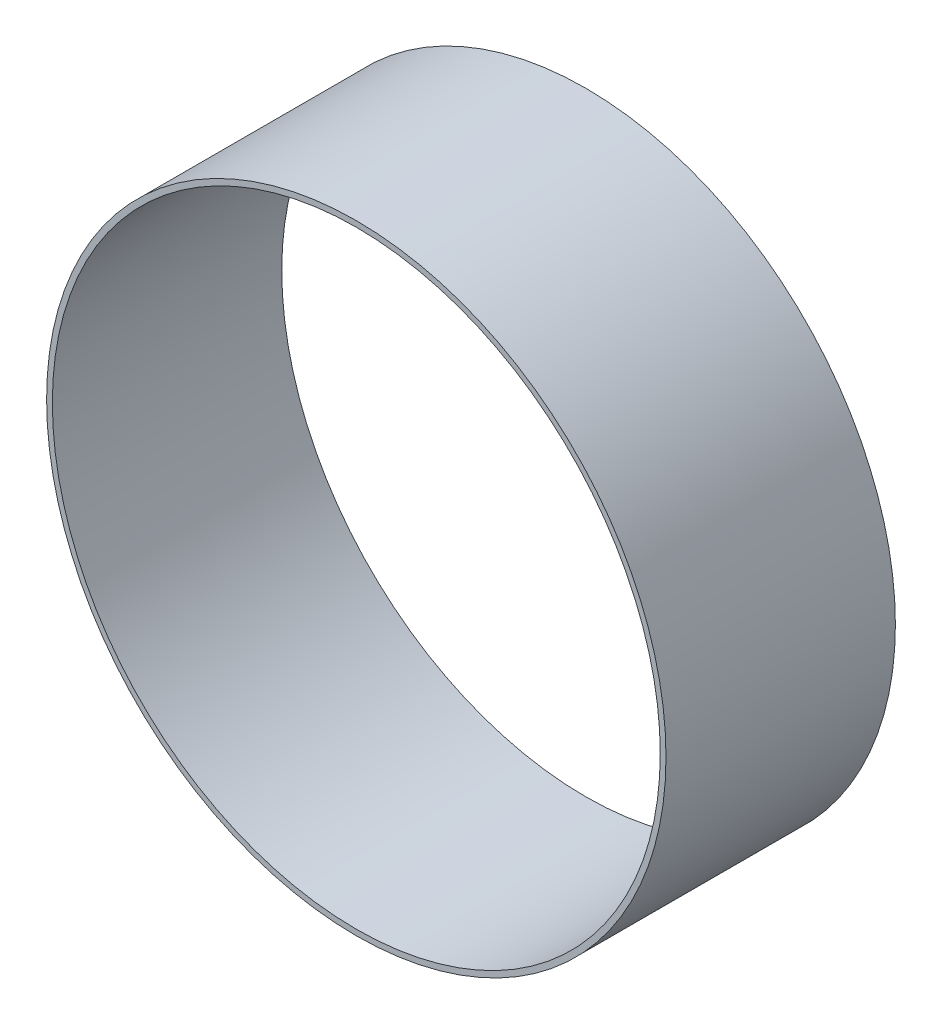
ISO-10303-21;
HEADER;
FILE_DESCRIPTION(('STEP AP214'),'2;1');
FILE_NAME('part.step','',(''),(''),'','','');
FILE_SCHEMA(('AUTOMOTIVE_DESIGN { 1 0 10303 214 1 1 1 1 }'));
ENDSEC;
DATA;
#1=APPLICATION_CONTEXT('core data for automotive mechanical design processes');
#2=APPLICATION_PROTOCOL_DEFINITION('international standard','automotive_design',2000,#1);
#3=PRODUCT_CONTEXT('',#1,'mechanical');
#4=PRODUCT('Part','Part','',(#3));
#5=PRODUCT_RELATED_PRODUCT_CATEGORY('part','',(#4));
#6=PRODUCT_DEFINITION_FORMATION('','',#4);
#7=PRODUCT_DEFINITION_CONTEXT('part definition',#1,'design');
#8=PRODUCT_DEFINITION('design','',#6,#7);
#9=PRODUCT_DEFINITION_SHAPE('','',#8);
#10=(LENGTH_UNIT() NAMED_UNIT(*) SI_UNIT(.MILLI.,.METRE.));
#11=(NAMED_UNIT(*) PLANE_ANGLE_UNIT() SI_UNIT($,.RADIAN.));
#12=(NAMED_UNIT(*) SI_UNIT($,.STERADIAN.) SOLID_ANGLE_UNIT());
#13=UNCERTAINTY_MEASURE_WITH_UNIT(LENGTH_MEASURE(1.E-05),#10,'distance_accuracy_value','');
#14=(GEOMETRIC_REPRESENTATION_CONTEXT(3) GLOBAL_UNCERTAINTY_ASSIGNED_CONTEXT((#13)) GLOBAL_UNIT_ASSIGNED_CONTEXT((#10,
#11,#12)) REPRESENTATION_CONTEXT('',''));
#15=CARTESIAN_POINT('',(0.,0.,0.));
#16=DIRECTION('',(0.,0.,1.));
#17=DIRECTION('',(1.,0.,0.));
#18=AXIS2_PLACEMENT_3D('',#15,#16,#17);
#19=CARTESIAN_POINT('',(0.,0.,8.));
#20=DIRECTION('',(0.,0.,1.));
#21=DIRECTION('',(1.,0.,0.));
#22=AXIS2_PLACEMENT_3D('',#19,#20,#21);
#23=PLANE('',#22);
#24=CARTESIAN_POINT('',(0.,0.,8.));
#25=DIRECTION('',(0.,0.,1.));
#26=DIRECTION('',(1.,0.,0.));
#27=AXIS2_PLACEMENT_3D('',#24,#25,#26);
#28=CIRCLE('',#27,10.8);
#29=CARTESIAN_POINT('',(10.8,0.,8.));
#30=VERTEX_POINT('',#29);
#31=EDGE_CURVE('E10',#30,#30,#28,.T.);
#32=ORIENTED_EDGE('',*,*,#31,.T.);
#33=EDGE_LOOP('',(#32));
#34=FACE_BOUND('',#33,.T.);
#35=CARTESIAN_POINT('',(0.,0.,8.));
#36=DIRECTION('',(0.,0.,1.));
#37=DIRECTION('',(1.,0.,0.));
#38=AXIS2_PLACEMENT_3D('',#35,#36,#37);
#39=CIRCLE('',#38,10.6);
#40=CARTESIAN_POINT('',(10.6,0.,8.));
#41=VERTEX_POINT('',#40);
#42=EDGE_CURVE('E42',#41,#41,#39,.T.);
#43=ORIENTED_EDGE('',*,*,#42,.F.);
#44=EDGE_LOOP('',(#43));
#45=FACE_BOUND('',#44,.T.);
#46=ADVANCED_FACE('F31',(#34,#45),#23,.T.);
#47=CARTESIAN_POINT('',(0.,0.,0.));
#48=DIRECTION('',(0.,0.,1.));
#49=DIRECTION('',(1.,0.,0.));
#50=AXIS2_PLACEMENT_3D('',#47,#48,#49);
#51=PLANE('',#50);
#52=CARTESIAN_POINT('',(0.,0.,0.));
#53=DIRECTION('',(0.,0.,1.));
#54=DIRECTION('',(1.,0.,0.));
#55=AXIS2_PLACEMENT_3D('',#52,#53,#54);
#56=CIRCLE('',#55,10.8);
#57=CARTESIAN_POINT('',(10.8,0.,0.));
#58=VERTEX_POINT('',#57);
#59=EDGE_CURVE('E35',#58,#58,#56,.T.);
#60=ORIENTED_EDGE('',*,*,#59,.F.);
#61=EDGE_LOOP('',(#60));
#62=FACE_BOUND('',#61,.T.);
#63=CARTESIAN_POINT('',(0.,0.,0.));
#64=DIRECTION('',(0.,0.,1.));
#65=DIRECTION('',(1.,0.,0.));
#66=AXIS2_PLACEMENT_3D('',#63,#64,#65);
#67=CIRCLE('',#66,10.6);
#68=CARTESIAN_POINT('',(10.6,0.,0.));
#69=VERTEX_POINT('',#68);
#70=EDGE_CURVE('E44',#69,#69,#67,.T.);
#71=ORIENTED_EDGE('',*,*,#70,.T.);
#72=EDGE_LOOP('',(#71));
#73=FACE_BOUND('',#72,.T.);
#74=ADVANCED_FACE('F54',(#62,#73),#51,.F.);
#75=CARTESIAN_POINT('',(0.,0.,8.));
#76=DIRECTION('',(0.,0.,-1.));
#77=DIRECTION('',(-1.,0.,0.));
#78=AXIS2_PLACEMENT_3D('',#75,#76,#77);
#79=CYLINDRICAL_SURFACE('',#78,10.8);
#80=ORIENTED_EDGE('',*,*,#31,.F.);
#81=EDGE_LOOP('',(#80));
#82=FACE_BOUND('',#81,.T.);
#83=ORIENTED_EDGE('',*,*,#59,.T.);
#84=EDGE_LOOP('',(#83));
#85=FACE_BOUND('',#84,.T.);
#86=ADVANCED_FACE('F33',(#82,#85),#79,.T.);
#87=CARTESIAN_POINT('',(0.,0.,8.));
#88=DIRECTION('',(0.,0.,-1.));
#89=DIRECTION('',(-1.,0.,0.));
#90=AXIS2_PLACEMENT_3D('',#87,#88,#89);
#91=CYLINDRICAL_SURFACE('',#90,10.6);
#92=ORIENTED_EDGE('',*,*,#42,.T.);
#93=EDGE_LOOP('',(#92));
#94=FACE_BOUND('',#93,.T.);
#95=ORIENTED_EDGE('',*,*,#70,.F.);
#96=EDGE_LOOP('',(#95));
#97=FACE_BOUND('',#96,.T.);
#98=ADVANCED_FACE('F50',(#94,#97),#91,.F.);
#99=CLOSED_SHELL('',(#46,#74,#86,#98));
#100=MANIFOLD_SOLID_BREP('B2',#99);
#101=ADVANCED_BREP_SHAPE_REPRESENTATION('',(#18,#100),#14);
#102=SHAPE_DEFINITION_REPRESENTATION(#9,#101);
ENDSEC;
END-ISO-10303-21;
